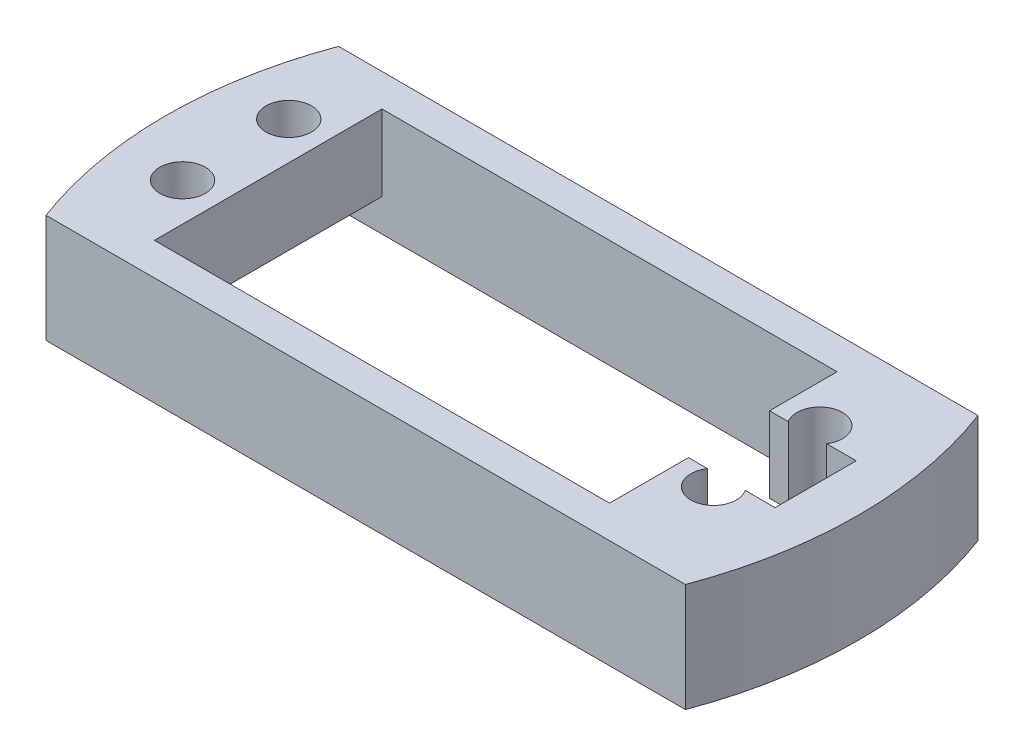
ISO-10303-21;
HEADER;
FILE_DESCRIPTION(('STEP AP214'),'2;1');
FILE_NAME('part.step','',(''),(''),'','','');
FILE_SCHEMA(('AUTOMOTIVE_DESIGN { 1 0 10303 214 1 1 1 1 }'));
ENDSEC;
DATA;
#1=APPLICATION_CONTEXT('core data for automotive mechanical design processes');
#2=APPLICATION_PROTOCOL_DEFINITION('international standard','automotive_design',2000,#1);
#3=PRODUCT_CONTEXT('',#1,'mechanical');
#4=PRODUCT('Part','Part','',(#3));
#5=PRODUCT_RELATED_PRODUCT_CATEGORY('part','',(#4));
#6=PRODUCT_DEFINITION_FORMATION('','',#4);
#7=PRODUCT_DEFINITION_CONTEXT('part definition',#1,'design');
#8=PRODUCT_DEFINITION('design','',#6,#7);
#9=PRODUCT_DEFINITION_SHAPE('','',#8);
#10=(LENGTH_UNIT() NAMED_UNIT(*) SI_UNIT(.MILLI.,.METRE.));
#11=(NAMED_UNIT(*) PLANE_ANGLE_UNIT() SI_UNIT($,.RADIAN.));
#12=(NAMED_UNIT(*) SI_UNIT($,.STERADIAN.) SOLID_ANGLE_UNIT());
#13=UNCERTAINTY_MEASURE_WITH_UNIT(LENGTH_MEASURE(1.E-05),#10,'distance_accuracy_value','');
#14=(GEOMETRIC_REPRESENTATION_CONTEXT(3) GLOBAL_UNCERTAINTY_ASSIGNED_CONTEXT((#13)) GLOBAL_UNIT_ASSIGNED_CONTEXT((#10,
#11,#12)) REPRESENTATION_CONTEXT('',''));
#15=CARTESIAN_POINT('',(0.,0.,0.));
#16=DIRECTION('',(0.,0.,1.));
#17=DIRECTION('',(1.,0.,0.));
#18=AXIS2_PLACEMENT_3D('',#15,#16,#17);
#19=CARTESIAN_POINT('',(-0.944487245360059,0.,-0.658978139905326));
#20=DIRECTION('',(0.,1.,0.));
#21=DIRECTION('',(0.,0.,1.));
#22=AXIS2_PLACEMENT_3D('',#19,#20,#21);
#23=PLANE('',#22);
#24=CARTESIAN_POINT('',(-0.944487245360059,0.,-0.658978139905326));
#25=DIRECTION('',(0.,1.,0.));
#26=DIRECTION('',(0.,0.,1.));
#27=AXIS2_PLACEMENT_3D('',#24,#25,#26);
#28=CIRCLE('',#27,38.5);
#29=CARTESIAN_POINT('',(-37.,0.,-14.1589781399053));
#30=VERTEX_POINT('',#29);
#31=CARTESIAN_POINT('',(-37.,0.,12.8410218600947));
#32=VERTEX_POINT('',#31);
#33=EDGE_CURVE('E216',#30,#32,#28,.T.);
#34=ORIENTED_EDGE('',*,*,#33,.F.);
#35=DIRECTION('',(-1.,0.,0.));
#36=VECTOR('',#35,1.);
#37=CARTESIAN_POINT('',(-37.,0.,-14.1589781399053));
#38=LINE('',#37,#36);
#39=CARTESIAN_POINT('',(22.,0.,-14.1589781399053));
#40=VERTEX_POINT('',#39);
#41=EDGE_CURVE('E226',#40,#30,#38,.T.);
#42=ORIENTED_EDGE('',*,*,#41,.F.);
#43=CARTESIAN_POINT('',(-14.0555127546399,0.,-0.658978139905322));
#44=DIRECTION('',(0.,1.,0.));
#45=DIRECTION('',(0.,0.,-1.));
#46=AXIS2_PLACEMENT_3D('',#43,#44,#45);
#47=CIRCLE('',#46,38.5);
#48=CARTESIAN_POINT('',(22.,0.,12.8410218600947));
#49=VERTEX_POINT('',#48);
#50=EDGE_CURVE('E237',#49,#40,#47,.T.);
#51=ORIENTED_EDGE('',*,*,#50,.F.);
#52=DIRECTION('',(1.,0.,0.));
#53=VECTOR('',#52,1.);
#54=CARTESIAN_POINT('',(-37.,0.,12.8410218600947));
#55=LINE('',#54,#53);
#56=EDGE_CURVE('E235',#32,#49,#55,.T.);
#57=ORIENTED_EDGE('',*,*,#56,.F.);
#58=EDGE_LOOP('',(#34,#42,#51,#57));
#59=FACE_BOUND('',#58,.T.);
#60=DIRECTION('',(-1.,0.,0.));
#61=VECTOR('',#60,1.);
#62=CARTESIAN_POINT('',(-30.,0.,-11.1589781399053));
#63=LINE('',#62,#61);
#64=CARTESIAN_POINT('',(19.9257558292541,0.,-11.1589781399053));
#65=VERTEX_POINT('',#64);
#66=CARTESIAN_POINT('',(-37.5773978895541,0.,-11.1589781399053));
#67=VERTEX_POINT('',#66);
#68=EDGE_CURVE('E323',#65,#67,#63,.T.);
#69=ORIENTED_EDGE('',*,*,#68,.T.);
#70=DIRECTION('',(0.,0.,1.));
#71=VECTOR('',#70,1.);
#72=CARTESIAN_POINT('',(-37.5773978895541,0.,-11.1589781399053));
#73=LINE('',#72,#71);
#74=CARTESIAN_POINT('',(-37.5773978895541,0.,9.84102186009467));
#75=VERTEX_POINT('',#74);
#76=EDGE_CURVE('E207',#67,#75,#73,.T.);
#77=ORIENTED_EDGE('',*,*,#76,.T.);
#78=DIRECTION('',(1.,0.,0.));
#79=VECTOR('',#78,1.);
#80=CARTESIAN_POINT('',(-30.,0.,9.84102186009467));
#81=LINE('',#80,#79);
#82=CARTESIAN_POINT('',(12.,0.,9.84102186009467));
#83=VERTEX_POINT('',#82);
#84=EDGE_CURVE('E325',#75,#83,#81,.T.);
#85=ORIENTED_EDGE('',*,*,#84,.T.);
#86=DIRECTION('',(0.,0.,-1.));
#87=VECTOR('',#86,1.);
#88=CARTESIAN_POINT('',(12.,0.,-11.1589781399053));
#89=LINE('',#88,#87);
#90=CARTESIAN_POINT('',(12.,0.,9.81782940820115));
#91=VERTEX_POINT('',#90);
#92=EDGE_CURVE('E311',#83,#91,#89,.T.);
#93=ORIENTED_EDGE('',*,*,#92,.T.);
#94=DIRECTION('',(1.,0.,0.));
#95=VECTOR('',#94,1.);
#96=CARTESIAN_POINT('',(12.,0.,9.81782940820115));
#97=LINE('',#96,#95);
#98=CARTESIAN_POINT('',(19.9257558292541,0.,9.81782940820115));
#99=VERTEX_POINT('',#98);
#100=EDGE_CURVE('E363',#91,#99,#97,.T.);
#101=ORIENTED_EDGE('',*,*,#100,.T.);
#102=DIRECTION('',(0.,0.,-1.));
#103=VECTOR('',#102,1.);
#104=CARTESIAN_POINT('',(19.9257558292541,0.,-11.1589781399053));
#105=LINE('',#104,#103);
#106=CARTESIAN_POINT('',(19.9257558292541,0.,2.56194208466654));
#107=VERTEX_POINT('',#106);
#108=EDGE_CURVE('E366',#99,#107,#105,.T.);
#109=ORIENTED_EDGE('',*,*,#108,.T.);
#110=DIRECTION('',(1.,0.,0.));
#111=VECTOR('',#110,1.);
#112=CARTESIAN_POINT('',(12.,0.,2.56194208466654));
#113=LINE('',#112,#111);
#114=CARTESIAN_POINT('',(20.,0.,2.56194208466654));
#115=VERTEX_POINT('',#114);
#116=EDGE_CURVE('E386',#107,#115,#113,.T.);
#117=ORIENTED_EDGE('',*,*,#116,.T.);
#118=DIRECTION('',(0.,0.,-1.));
#119=VECTOR('',#118,1.);
#120=CARTESIAN_POINT('',(20.,0.,-4.92377280863803));
#121=LINE('',#120,#119);
#122=CARTESIAN_POINT('',(20.,0.,-4.92377280863803));
#123=VERTEX_POINT('',#122);
#124=EDGE_CURVE('E393',#115,#123,#121,.T.);
#125=ORIENTED_EDGE('',*,*,#124,.T.);
#126=DIRECTION('',(-1.,0.,0.));
#127=VECTOR('',#126,1.);
#128=CARTESIAN_POINT('',(12.,0.,-4.92377280863803));
#129=LINE('',#128,#127);
#130=CARTESIAN_POINT('',(19.9257558292541,0.,-4.92377280863803));
#131=VERTEX_POINT('',#130);
#132=EDGE_CURVE('E291',#123,#131,#129,.T.);
#133=ORIENTED_EDGE('',*,*,#132,.T.);
#134=EDGE_CURVE('E365',#131,#65,#105,.T.);
#135=ORIENTED_EDGE('',*,*,#134,.T.);
#136=EDGE_LOOP('',(#69,#77,#85,#93,#101,#109,#117,#125,#133,#135));
#137=FACE_BOUND('',#136,.T.);
#138=ADVANCED_FACE('F36',(#59,#137),#23,.F.);
#139=CARTESIAN_POINT('',(12.,10.,-11.1589781399053));
#140=DIRECTION('',(-1.,0.,0.));
#141=DIRECTION('',(0.,0.,1.));
#142=AXIS2_PLACEMENT_3D('',#139,#140,#141);
#143=PLANE('',#142);
#144=DIRECTION('',(0.,0.,1.));
#145=VECTOR('',#144,1.);
#146=CARTESIAN_POINT('',(12.,3.,-11.1589781399053));
#147=LINE('',#146,#145);
#148=CARTESIAN_POINT('',(12.,3.,2.56194208466654));
#149=VERTEX_POINT('',#148);
#150=CARTESIAN_POINT('',(12.,3.,9.81782940820115));
#151=VERTEX_POINT('',#150);
#152=EDGE_CURVE('E278',#149,#151,#147,.T.);
#153=ORIENTED_EDGE('',*,*,#152,.T.);
#154=DIRECTION('',(0.,-1.,0.));
#155=VECTOR('',#154,1.);
#156=CARTESIAN_POINT('',(12.,3.,9.81782940820115));
#157=LINE('',#156,#155);
#158=EDGE_CURVE('E342',#151,#91,#157,.T.);
#159=ORIENTED_EDGE('',*,*,#158,.T.);
#160=ORIENTED_EDGE('',*,*,#92,.F.);
#161=DIRECTION('',(0.,-1.,0.));
#162=VECTOR('',#161,1.);
#163=CARTESIAN_POINT('',(12.,10.,9.84102186009467));
#164=LINE('',#163,#162);
#165=CARTESIAN_POINT('',(12.,10.,9.84102186009467));
#166=VERTEX_POINT('',#165);
#167=EDGE_CURVE('E218',#166,#83,#164,.T.);
#168=ORIENTED_EDGE('',*,*,#167,.F.);
#169=DIRECTION('',(0.,0.,-1.));
#170=VECTOR('',#169,1.);
#171=CARTESIAN_POINT('',(12.,10.,-11.1589781399053));
#172=LINE('',#171,#170);
#173=CARTESIAN_POINT('',(12.,10.,2.56194208466654));
#174=VERTEX_POINT('',#173);
#175=EDGE_CURVE('E312',#166,#174,#172,.T.);
#176=ORIENTED_EDGE('',*,*,#175,.T.);
#177=DIRECTION('',(0.,-1.,0.));
#178=VECTOR('',#177,1.);
#179=CARTESIAN_POINT('',(12.,10.,2.56194208466654));
#180=LINE('',#179,#178);
#181=EDGE_CURVE('E296',#174,#149,#180,.T.);
#182=ORIENTED_EDGE('',*,*,#181,.T.);
#183=EDGE_LOOP('',(#153,#159,#160,#168,#176,#182));
#184=FACE_BOUND('',#183,.T.);
#185=ADVANCED_FACE('F423',(#184),#143,.T.);
#186=CARTESIAN_POINT('',(12.,10.,2.56194208466654));
#187=DIRECTION('',(0.,0.,-1.));
#188=DIRECTION('',(-1.,0.,0.));
#189=AXIS2_PLACEMENT_3D('',#186,#187,#188);
#190=PLANE('',#189);
#191=ORIENTED_EDGE('',*,*,#116,.F.);
#192=DIRECTION('',(0.,1.,0.));
#193=VECTOR('',#192,1.);
#194=CARTESIAN_POINT('',(19.9257558292541,10.,2.56194208466654));
#195=LINE('',#194,#193);
#196=CARTESIAN_POINT('',(19.9257558292541,3.,2.56194208466654));
#197=VERTEX_POINT('',#196);
#198=EDGE_CURVE('E380',#107,#197,#195,.T.);
#199=ORIENTED_EDGE('',*,*,#198,.T.);
#200=DIRECTION('',(1.,0.,0.));
#201=VECTOR('',#200,1.);
#202=CARTESIAN_POINT('',(12.,3.,2.56194208466654));
#203=LINE('',#202,#201);
#204=CARTESIAN_POINT('',(17.2377487974895,3.,2.56194208466654));
#205=VERTEX_POINT('',#204);
#206=EDGE_CURVE('E375',#205,#197,#203,.T.);
#207=ORIENTED_EDGE('',*,*,#206,.F.);
#208=DIRECTION('',(0.,-1.,0.));
#209=VECTOR('',#208,1.);
#210=CARTESIAN_POINT('',(17.2377487974895,10.,2.56194208466654));
#211=LINE('',#210,#209);
#212=CARTESIAN_POINT('',(17.2377487974895,10.,2.56194208466654));
#213=VERTEX_POINT('',#212);
#214=EDGE_CURVE('E253',#213,#205,#211,.T.);
#215=ORIENTED_EDGE('',*,*,#214,.F.);
#216=DIRECTION('',(1.,0.,0.));
#217=VECTOR('',#216,1.);
#218=CARTESIAN_POINT('',(12.,10.,2.56194208466654));
#219=LINE('',#218,#217);
#220=CARTESIAN_POINT('',(20.,10.,2.56194208466654));
#221=VERTEX_POINT('',#220);
#222=EDGE_CURVE('E391',#213,#221,#219,.T.);
#223=ORIENTED_EDGE('',*,*,#222,.T.);
#224=DIRECTION('',(0.,-1.,0.));
#225=VECTOR('',#224,1.);
#226=CARTESIAN_POINT('',(20.,10.,2.56194208466654));
#227=LINE('',#226,#225);
#228=EDGE_CURVE('E286',#221,#115,#227,.T.);
#229=ORIENTED_EDGE('',*,*,#228,.T.);
#230=EDGE_LOOP('',(#191,#199,#207,#215,#223,#229));
#231=FACE_BOUND('',#230,.T.);
#232=ADVANCED_FACE('F402',(#231),#190,.T.);
#233=CARTESIAN_POINT('',(12.,10.,-4.92377280863803));
#234=DIRECTION('',(0.,0.,1.));
#235=DIRECTION('',(1.,0.,0.));
#236=AXIS2_PLACEMENT_3D('',#233,#234,#235);
#237=PLANE('',#236);
#238=DIRECTION('',(-1.,0.,0.));
#239=VECTOR('',#238,1.);
#240=CARTESIAN_POINT('',(12.,3.,-4.92377280863803));
#241=LINE('',#240,#239);
#242=CARTESIAN_POINT('',(19.9257558292541,3.,-4.92377280863803));
#243=VERTEX_POINT('',#242);
#244=CARTESIAN_POINT('',(17.2667226312759,3.,-4.92377280863803));
#245=VERTEX_POINT('',#244);
#246=EDGE_CURVE('E373',#243,#245,#241,.T.);
#247=ORIENTED_EDGE('',*,*,#246,.F.);
#248=DIRECTION('',(0.,-1.,0.));
#249=VECTOR('',#248,1.);
#250=CARTESIAN_POINT('',(19.9257558292541,10.,-4.92377280863803));
#251=LINE('',#250,#249);
#252=EDGE_CURVE('E11',#243,#131,#251,.T.);
#253=ORIENTED_EDGE('',*,*,#252,.T.);
#254=ORIENTED_EDGE('',*,*,#132,.F.);
#255=DIRECTION('',(0.,-1.,0.));
#256=VECTOR('',#255,1.);
#257=CARTESIAN_POINT('',(20.,10.,-4.92377280863803));
#258=LINE('',#257,#256);
#259=CARTESIAN_POINT('',(20.,10.,-4.92377280863803));
#260=VERTEX_POINT('',#259);
#261=EDGE_CURVE('E283',#260,#123,#258,.T.);
#262=ORIENTED_EDGE('',*,*,#261,.F.);
#263=DIRECTION('',(-1.,0.,0.));
#264=VECTOR('',#263,1.);
#265=CARTESIAN_POINT('',(12.,10.,-4.92377280863803));
#266=LINE('',#265,#264);
#267=CARTESIAN_POINT('',(17.2667226312759,10.,-4.92377280863803));
#268=VERTEX_POINT('',#267);
#269=EDGE_CURVE('E284',#260,#268,#266,.T.);
#270=ORIENTED_EDGE('',*,*,#269,.T.);
#271=DIRECTION('',(0.,-1.,0.));
#272=VECTOR('',#271,1.);
#273=CARTESIAN_POINT('',(17.2667226312759,10.,-4.92377280863803));
#274=LINE('',#273,#272);
#275=EDGE_CURVE('E256',#245,#268,#274,.F.);
#276=ORIENTED_EDGE('',*,*,#275,.F.);
#277=EDGE_LOOP('',(#247,#253,#254,#262,#270,#276));
#278=FACE_BOUND('',#277,.T.);
#279=ADVANCED_FACE('F415',(#278),#237,.T.);
#280=CARTESIAN_POINT('',(-0.944487245360059,10.,-0.658978139905326));
#281=DIRECTION('',(0.,1.,0.));
#282=DIRECTION('',(0.,0.,1.));
#283=AXIS2_PLACEMENT_3D('',#280,#281,#282);
#284=PLANE('',#283);
#285=CARTESIAN_POINT('',(-33.5,10.,-6.05897813990532));
#286=DIRECTION('',(0.,1.,0.));
#287=DIRECTION('',(0.,0.,-1.));
#288=AXIS2_PLACEMENT_3D('',#285,#286,#287);
#289=CIRCLE('',#288,2.1);
#290=CARTESIAN_POINT('',(-33.5,10.,-8.15897813990532));
#291=VERTEX_POINT('',#290);
#292=EDGE_CURVE('E302',#291,#291,#289,.T.);
#293=ORIENTED_EDGE('',*,*,#292,.F.);
#294=EDGE_LOOP('',(#293));
#295=FACE_BOUND('',#294,.T.);
#296=CARTESIAN_POINT('',(-0.944487245360059,10.,-0.658978139905326));
#297=DIRECTION('',(0.,1.,0.));
#298=DIRECTION('',(0.,0.,1.));
#299=AXIS2_PLACEMENT_3D('',#296,#297,#298);
#300=CIRCLE('',#299,38.5);
#301=CARTESIAN_POINT('',(-37.,10.,-14.1589781399053));
#302=VERTEX_POINT('',#301);
#303=CARTESIAN_POINT('',(-37.,10.,12.8410218600947));
#304=VERTEX_POINT('',#303);
#305=EDGE_CURVE('E222',#302,#304,#300,.T.);
#306=ORIENTED_EDGE('',*,*,#305,.T.);
#307=DIRECTION('',(1.,0.,0.));
#308=VECTOR('',#307,1.);
#309=CARTESIAN_POINT('',(-37.,10.,12.8410218600947));
#310=LINE('',#309,#308);
#311=CARTESIAN_POINT('',(22.,10.,12.8410218600947));
#312=VERTEX_POINT('',#311);
#313=EDGE_CURVE('E225',#304,#312,#310,.T.);
#314=ORIENTED_EDGE('',*,*,#313,.T.);
#315=CARTESIAN_POINT('',(-14.0555127546399,10.,-0.658978139905322));
#316=DIRECTION('',(0.,1.,0.));
#317=DIRECTION('',(0.,0.,-1.));
#318=AXIS2_PLACEMENT_3D('',#315,#316,#317);
#319=CIRCLE('',#318,38.5);
#320=CARTESIAN_POINT('',(22.,10.,-14.1589781399053));
#321=VERTEX_POINT('',#320);
#322=EDGE_CURVE('E228',#312,#321,#319,.T.);
#323=ORIENTED_EDGE('',*,*,#322,.T.);
#324=DIRECTION('',(-1.,0.,0.));
#325=VECTOR('',#324,1.);
#326=CARTESIAN_POINT('',(-37.,10.,-14.1589781399053));
#327=LINE('',#326,#325);
#328=EDGE_CURVE('E230',#321,#302,#327,.T.);
#329=ORIENTED_EDGE('',*,*,#328,.T.);
#330=EDGE_LOOP('',(#306,#314,#323,#329));
#331=FACE_BOUND('',#330,.T.);
#332=CARTESIAN_POINT('',(-33.5,10.,3.74102186009468));
#333=DIRECTION('',(0.,1.,0.));
#334=DIRECTION('',(0.,0.,-1.));
#335=AXIS2_PLACEMENT_3D('',#332,#333,#334);
#336=CIRCLE('',#335,2.1);
#337=CARTESIAN_POINT('',(-33.5,10.,1.64102186009468));
#338=VERTEX_POINT('',#337);
#339=EDGE_CURVE('E299',#338,#338,#336,.T.);
#340=ORIENTED_EDGE('',*,*,#339,.F.);
#341=EDGE_LOOP('',(#340));
#342=FACE_BOUND('',#341,.T.);
#343=CARTESIAN_POINT('',(15.5,10.,3.74102186009467));
#344=DIRECTION('',(0.,1.,0.));
#345=DIRECTION('',(0.,0.,1.));
#346=AXIS2_PLACEMENT_3D('',#343,#344,#345);
#347=CIRCLE('',#346,2.1);
#348=CARTESIAN_POINT('',(13.7622512025105,10.,2.56194208466654));
#349=VERTEX_POINT('',#348);
#350=EDGE_CURVE('E305',#349,#213,#347,.T.);
#351=ORIENTED_EDGE('',*,*,#350,.F.);
#352=EDGE_CURVE('E387',#174,#349,#219,.T.);
#353=ORIENTED_EDGE('',*,*,#352,.F.);
#354=ORIENTED_EDGE('',*,*,#175,.F.);
#355=DIRECTION('',(1.,0.,0.));
#356=VECTOR('',#355,1.);
#357=CARTESIAN_POINT('',(-30.,10.,9.84102186009467));
#358=LINE('',#357,#356);
#359=CARTESIAN_POINT('',(-30.,10.,9.84102186009467));
#360=VERTEX_POINT('',#359);
#361=EDGE_CURVE('E319',#360,#166,#358,.T.);
#362=ORIENTED_EDGE('',*,*,#361,.F.);
#363=DIRECTION('',(0.,0.,1.));
#364=VECTOR('',#363,1.);
#365=CARTESIAN_POINT('',(-30.,10.,-11.1589781399053));
#366=LINE('',#365,#364);
#367=CARTESIAN_POINT('',(-30.,10.,-11.1589781399053));
#368=VERTEX_POINT('',#367);
#369=EDGE_CURVE('E317',#368,#360,#366,.T.);
#370=ORIENTED_EDGE('',*,*,#369,.F.);
#371=DIRECTION('',(-1.,0.,0.));
#372=VECTOR('',#371,1.);
#373=CARTESIAN_POINT('',(-30.,10.,-11.1589781399053));
#374=LINE('',#373,#372);
#375=CARTESIAN_POINT('',(12.,10.,-11.1589781399053));
#376=VERTEX_POINT('',#375);
#377=EDGE_CURVE('E212',#376,#368,#374,.T.);
#378=ORIENTED_EDGE('',*,*,#377,.F.);
#379=CARTESIAN_POINT('',(12.,10.,-4.92377280863803));
#380=VERTEX_POINT('',#379);
#381=EDGE_CURVE('E315',#380,#376,#172,.T.);
#382=ORIENTED_EDGE('',*,*,#381,.F.);
#383=CARTESIAN_POINT('',(13.7332773687241,10.,-4.92377280863803));
#384=VERTEX_POINT('',#383);
#385=EDGE_CURVE('E282',#384,#380,#266,.T.);
#386=ORIENTED_EDGE('',*,*,#385,.F.);
#387=CARTESIAN_POINT('',(15.5,10.,-6.05897813990533));
#388=DIRECTION('',(0.,1.,0.));
#389=DIRECTION('',(0.,0.,1.));
#390=AXIS2_PLACEMENT_3D('',#387,#388,#389);
#391=CIRCLE('',#390,2.1);
#392=EDGE_CURVE('E308',#268,#384,#391,.T.);
#393=ORIENTED_EDGE('',*,*,#392,.F.);
#394=ORIENTED_EDGE('',*,*,#269,.F.);
#395=DIRECTION('',(0.,0.,-1.));
#396=VECTOR('',#395,1.);
#397=CARTESIAN_POINT('',(20.,10.,-4.92377280863803));
#398=LINE('',#397,#396);
#399=EDGE_CURVE('E390',#221,#260,#398,.T.);
#400=ORIENTED_EDGE('',*,*,#399,.F.);
#401=ORIENTED_EDGE('',*,*,#222,.F.);
#402=EDGE_LOOP('',(#351,#353,#354,#362,#370,#378,#382,#386,#393,#394,#400,#401));
#403=FACE_BOUND('',#402,.T.);
#404=ADVANCED_FACE('F410',(#295,#331,#342,#403),#284,.T.);
#405=CARTESIAN_POINT('',(12.,3.,-11.1589781399053));
#406=VERTEX_POINT('',#405);
#407=CARTESIAN_POINT('',(12.,3.,-4.92377280863803));
#408=VERTEX_POINT('',#407);
#409=EDGE_CURVE('E267',#406,#408,#147,.T.);
#410=ORIENTED_EDGE('',*,*,#409,.T.);
#411=DIRECTION('',(0.,-1.,0.));
#412=VECTOR('',#411,1.);
#413=CARTESIAN_POINT('',(12.,10.,-4.92377280863803));
#414=LINE('',#413,#412);
#415=EDGE_CURVE('E275',#380,#408,#414,.T.);
#416=ORIENTED_EDGE('',*,*,#415,.F.);
#417=ORIENTED_EDGE('',*,*,#381,.T.);
#418=DIRECTION('',(0.,-1.,0.));
#419=VECTOR('',#418,1.);
#420=CARTESIAN_POINT('',(12.,10.,-11.1589781399053));
#421=LINE('',#420,#419);
#422=EDGE_CURVE('E213',#376,#406,#421,.T.);
#423=ORIENTED_EDGE('',*,*,#422,.T.);
#424=EDGE_LOOP('',(#410,#416,#417,#423));
#425=FACE_BOUND('',#424,.T.);
#426=ADVANCED_FACE('F274',(#425),#143,.T.);
#427=CARTESIAN_POINT('',(15.5,10.,-6.05897813990533));
#428=DIRECTION('',(0.,-1.,0.));
#429=DIRECTION('',(0.,0.,-1.));
#430=AXIS2_PLACEMENT_3D('',#427,#428,#429);
#431=CYLINDRICAL_SURFACE('',#430,2.1);
#432=CARTESIAN_POINT('',(15.5,3.,-6.05897813990533));
#433=DIRECTION('',(0.,1.,0.));
#434=DIRECTION('',(0.,0.,1.));
#435=AXIS2_PLACEMENT_3D('',#432,#433,#434);
#436=CIRCLE('',#435,2.1);
#437=CARTESIAN_POINT('',(13.7332773687241,3.,-4.92377280863803));
#438=VERTEX_POINT('',#437);
#439=EDGE_CURVE('E269',#245,#438,#436,.T.);
#440=ORIENTED_EDGE('',*,*,#439,.F.);
#441=ORIENTED_EDGE('',*,*,#275,.T.);
#442=ORIENTED_EDGE('',*,*,#392,.T.);
#443=DIRECTION('',(0.,-1.,0.));
#444=VECTOR('',#443,1.);
#445=CARTESIAN_POINT('',(13.7332773687241,10.,-4.92377280863803));
#446=LINE('',#445,#444);
#447=EDGE_CURVE('E258',#384,#438,#446,.T.);
#448=ORIENTED_EDGE('',*,*,#447,.T.);
#449=EDGE_LOOP('',(#440,#441,#442,#448));
#450=FACE_BOUND('',#449,.T.);
#451=ADVANCED_FACE('F432',(#450),#431,.F.);
#452=CARTESIAN_POINT('',(15.5,10.,3.74102186009467));
#453=DIRECTION('',(0.,-1.,0.));
#454=DIRECTION('',(0.,0.,-1.));
#455=AXIS2_PLACEMENT_3D('',#452,#453,#454);
#456=CYLINDRICAL_SURFACE('',#455,2.1);
#457=CARTESIAN_POINT('',(15.5,3.,3.74102186009467));
#458=DIRECTION('',(0.,1.,0.));
#459=DIRECTION('',(0.,0.,1.));
#460=AXIS2_PLACEMENT_3D('',#457,#458,#459);
#461=CIRCLE('',#460,2.1);
#462=CARTESIAN_POINT('',(13.7622512025105,3.,2.56194208466654));
#463=VERTEX_POINT('',#462);
#464=EDGE_CURVE('E60',#463,#205,#461,.T.);
#465=ORIENTED_EDGE('',*,*,#464,.F.);
#466=DIRECTION('',(0.,-1.,0.));
#467=VECTOR('',#466,1.);
#468=CARTESIAN_POINT('',(13.7622512025105,10.,2.56194208466654));
#469=LINE('',#468,#467);
#470=EDGE_CURVE('E251',#463,#349,#469,.F.);
#471=ORIENTED_EDGE('',*,*,#470,.T.);
#472=ORIENTED_EDGE('',*,*,#350,.T.);
#473=ORIENTED_EDGE('',*,*,#214,.T.);
#474=EDGE_LOOP('',(#465,#471,#472,#473));
#475=FACE_BOUND('',#474,.T.);
#476=ADVANCED_FACE('F430',(#475),#456,.F.);
#477=CARTESIAN_POINT('',(-0.944487245360059,10.,-0.658978139905326));
#478=DIRECTION('',(0.,-1.,0.));
#479=DIRECTION('',(0.,0.,-1.));
#480=AXIS2_PLACEMENT_3D('',#477,#478,#479);
#481=CYLINDRICAL_SURFACE('',#480,38.5);
#482=ORIENTED_EDGE('',*,*,#33,.T.);
#483=DIRECTION('',(0.,-1.,0.));
#484=VECTOR('',#483,1.);
#485=CARTESIAN_POINT('',(-37.,10.,12.8410218600947));
#486=LINE('',#485,#484);
#487=EDGE_CURVE('E248',#304,#32,#486,.T.);
#488=ORIENTED_EDGE('',*,*,#487,.F.);
#489=ORIENTED_EDGE('',*,*,#305,.F.);
#490=DIRECTION('',(0.,-1.,0.));
#491=VECTOR('',#490,1.);
#492=CARTESIAN_POINT('',(-37.,10.,-14.1589781399053));
#493=LINE('',#492,#491);
#494=EDGE_CURVE('E232',#302,#30,#493,.T.);
#495=ORIENTED_EDGE('',*,*,#494,.T.);
#496=EDGE_LOOP('',(#482,#488,#489,#495));
#497=FACE_BOUND('',#496,.T.);
#498=ADVANCED_FACE('F38',(#497),#481,.T.);
#499=CARTESIAN_POINT('',(-37.,10.,12.8410218600947));
#500=DIRECTION('',(0.,0.,-1.));
#501=DIRECTION('',(-1.,0.,0.));
#502=AXIS2_PLACEMENT_3D('',#499,#500,#501);
#503=PLANE('',#502);
#504=ORIENTED_EDGE('',*,*,#56,.T.);
#505=DIRECTION('',(0.,-1.,0.));
#506=VECTOR('',#505,1.);
#507=CARTESIAN_POINT('',(22.,10.,12.8410218600947));
#508=LINE('',#507,#506);
#509=EDGE_CURVE('E245',#312,#49,#508,.T.);
#510=ORIENTED_EDGE('',*,*,#509,.F.);
#511=ORIENTED_EDGE('',*,*,#313,.F.);
#512=ORIENTED_EDGE('',*,*,#487,.T.);
#513=EDGE_LOOP('',(#504,#510,#511,#512));
#514=FACE_BOUND('',#513,.T.);
#515=ADVANCED_FACE('F438',(#514),#503,.F.);
#516=CARTESIAN_POINT('',(-14.0555127546399,10.,-0.658978139905322));
#517=DIRECTION('',(0.,-1.,0.));
#518=DIRECTION('',(0.,0.,-1.));
#519=AXIS2_PLACEMENT_3D('',#516,#517,#518);
#520=CYLINDRICAL_SURFACE('',#519,38.5);
#521=ORIENTED_EDGE('',*,*,#50,.T.);
#522=DIRECTION('',(0.,-1.,0.));
#523=VECTOR('',#522,1.);
#524=CARTESIAN_POINT('',(22.,10.,-14.1589781399053));
#525=LINE('',#524,#523);
#526=EDGE_CURVE('E242',#321,#40,#525,.T.);
#527=ORIENTED_EDGE('',*,*,#526,.F.);
#528=ORIENTED_EDGE('',*,*,#322,.F.);
#529=ORIENTED_EDGE('',*,*,#509,.T.);
#530=EDGE_LOOP('',(#521,#527,#528,#529));
#531=FACE_BOUND('',#530,.T.);
#532=ADVANCED_FACE('F456',(#531),#520,.T.);
#533=CARTESIAN_POINT('',(-37.,10.,-14.1589781399053));
#534=DIRECTION('',(0.,0.,1.));
#535=DIRECTION('',(1.,0.,0.));
#536=AXIS2_PLACEMENT_3D('',#533,#534,#535);
#537=PLANE('',#536);
#538=ORIENTED_EDGE('',*,*,#41,.T.);
#539=ORIENTED_EDGE('',*,*,#494,.F.);
#540=ORIENTED_EDGE('',*,*,#328,.F.);
#541=ORIENTED_EDGE('',*,*,#526,.T.);
#542=EDGE_LOOP('',(#538,#539,#540,#541));
#543=FACE_BOUND('',#542,.T.);
#544=ADVANCED_FACE('F453',(#543),#537,.F.);
#545=CARTESIAN_POINT('',(-30.,10.,-11.1589781399053));
#546=DIRECTION('',(0.,0.,1.));
#547=DIRECTION('',(1.,0.,0.));
#548=AXIS2_PLACEMENT_3D('',#545,#546,#547);
#549=PLANE('',#548);
#550=ORIENTED_EDGE('',*,*,#68,.F.);
#551=DIRECTION('',(0.,-1.,0.));
#552=VECTOR('',#551,1.);
#553=CARTESIAN_POINT('',(19.9257558292541,3.,-11.1589781399053));
#554=LINE('',#553,#552);
#555=CARTESIAN_POINT('',(19.9257558292541,3.,-11.1589781399053));
#556=VERTEX_POINT('',#555);
#557=EDGE_CURVE('E362',#556,#65,#554,.T.);
#558=ORIENTED_EDGE('',*,*,#557,.F.);
#559=DIRECTION('',(-1.,0.,0.));
#560=VECTOR('',#559,1.);
#561=CARTESIAN_POINT('',(12.,3.,-11.1589781399053));
#562=LINE('',#561,#560);
#563=EDGE_CURVE('E360',#556,#406,#562,.T.);
#564=ORIENTED_EDGE('',*,*,#563,.T.);
#565=ORIENTED_EDGE('',*,*,#422,.F.);
#566=ORIENTED_EDGE('',*,*,#377,.T.);
#567=DIRECTION('',(0.,-1.,0.));
#568=VECTOR('',#567,1.);
#569=CARTESIAN_POINT('',(-30.,10.,-11.1589781399053));
#570=LINE('',#569,#568);
#571=CARTESIAN_POINT('',(-30.,3.,-11.1589781399053));
#572=VERTEX_POINT('',#571);
#573=EDGE_CURVE('E204',#368,#572,#570,.T.);
#574=ORIENTED_EDGE('',*,*,#573,.T.);
#575=DIRECTION('',(-1.,0.,0.));
#576=VECTOR('',#575,1.);
#577=CARTESIAN_POINT('',(-30.,3.,-11.1589781399053));
#578=LINE('',#577,#576);
#579=CARTESIAN_POINT('',(-37.5773978895541,3.,-11.1589781399053));
#580=VERTEX_POINT('',#579);
#581=EDGE_CURVE('E191',#572,#580,#578,.T.);
#582=ORIENTED_EDGE('',*,*,#581,.T.);
#583=DIRECTION('',(0.,-1.,0.));
#584=VECTOR('',#583,1.);
#585=CARTESIAN_POINT('',(-37.5773978895541,3.,-11.1589781399053));
#586=LINE('',#585,#584);
#587=EDGE_CURVE('E353',#580,#67,#586,.T.);
#588=ORIENTED_EDGE('',*,*,#587,.T.);
#589=EDGE_LOOP('',(#550,#558,#564,#565,#566,#574,#582,#588));
#590=FACE_BOUND('',#589,.T.);
#591=ADVANCED_FACE('F209',(#590),#549,.T.);
#592=CARTESIAN_POINT('',(-30.,10.,-11.1589781399053));
#593=DIRECTION('',(1.,0.,0.));
#594=DIRECTION('',(0.,0.,-1.));
#595=AXIS2_PLACEMENT_3D('',#592,#593,#594);
#596=PLANE('',#595);
#597=DIRECTION('',(0.,0.,-1.));
#598=VECTOR('',#597,1.);
#599=CARTESIAN_POINT('',(-30.,3.,-11.1589781399053));
#600=LINE('',#599,#598);
#601=CARTESIAN_POINT('',(-30.,3.,9.84102186009467));
#602=VERTEX_POINT('',#601);
#603=EDGE_CURVE('E52',#602,#572,#600,.T.);
#604=ORIENTED_EDGE('',*,*,#603,.T.);
#605=ORIENTED_EDGE('',*,*,#573,.F.);
#606=ORIENTED_EDGE('',*,*,#369,.T.);
#607=DIRECTION('',(0.,-1.,0.));
#608=VECTOR('',#607,1.);
#609=CARTESIAN_POINT('',(-30.,10.,9.84102186009467));
#610=LINE('',#609,#608);
#611=EDGE_CURVE('E206',#360,#602,#610,.T.);
#612=ORIENTED_EDGE('',*,*,#611,.T.);
#613=EDGE_LOOP('',(#604,#605,#606,#612));
#614=FACE_BOUND('',#613,.T.);
#615=ADVANCED_FACE('F202',(#614),#596,.T.);
#616=CARTESIAN_POINT('',(-30.,10.,9.84102186009467));
#617=DIRECTION('',(0.,0.,-1.));
#618=DIRECTION('',(-1.,0.,0.));
#619=AXIS2_PLACEMENT_3D('',#616,#617,#618);
#620=PLANE('',#619);
#621=ORIENTED_EDGE('',*,*,#84,.F.);
#622=DIRECTION('',(0.,-1.,0.));
#623=VECTOR('',#622,1.);
#624=CARTESIAN_POINT('',(-37.5773978895541,3.,9.84102186009467));
#625=LINE('',#624,#623);
#626=CARTESIAN_POINT('',(-37.5773978895541,3.,9.84102186009467));
#627=VERTEX_POINT('',#626);
#628=EDGE_CURVE('E351',#627,#75,#625,.T.);
#629=ORIENTED_EDGE('',*,*,#628,.F.);
#630=DIRECTION('',(1.,0.,0.));
#631=VECTOR('',#630,1.);
#632=CARTESIAN_POINT('',(-37.5773978895541,3.,9.84102186009467));
#633=LINE('',#632,#631);
#634=EDGE_CURVE('E349',#627,#602,#633,.T.);
#635=ORIENTED_EDGE('',*,*,#634,.T.);
#636=ORIENTED_EDGE('',*,*,#611,.F.);
#637=ORIENTED_EDGE('',*,*,#361,.T.);
#638=ORIENTED_EDGE('',*,*,#167,.T.);
#639=EDGE_LOOP('',(#621,#629,#635,#636,#637,#638));
#640=FACE_BOUND('',#639,.T.);
#641=ADVANCED_FACE('F330',(#640),#620,.T.);
#642=CARTESIAN_POINT('',(-33.5,10.,-6.05897813990532));
#643=DIRECTION('',(0.,-1.,0.));
#644=DIRECTION('',(0.,0.,-1.));
#645=AXIS2_PLACEMENT_3D('',#642,#643,#644);
#646=CYLINDRICAL_SURFACE('',#645,2.1);
#647=CARTESIAN_POINT('',(-33.5,3.,-6.05897813990532));
#648=DIRECTION('',(0.,1.,0.));
#649=DIRECTION('',(0.,0.,1.));
#650=AXIS2_PLACEMENT_3D('',#647,#648,#649);
#651=CIRCLE('',#650,2.1);
#652=CARTESIAN_POINT('',(-33.5,3.,-3.95897813990532));
#653=VERTEX_POINT('',#652);
#654=EDGE_CURVE('E383',#653,#653,#651,.T.);
#655=ORIENTED_EDGE('',*,*,#654,.F.);
#656=EDGE_LOOP('',(#655));
#657=FACE_BOUND('',#656,.T.);
#658=ORIENTED_EDGE('',*,*,#292,.T.);
#659=EDGE_LOOP('',(#658));
#660=FACE_BOUND('',#659,.T.);
#661=ADVANCED_FACE('F481',(#657,#660),#646,.F.);
#662=CARTESIAN_POINT('',(-33.5,10.,3.74102186009468));
#663=DIRECTION('',(0.,-1.,0.));
#664=DIRECTION('',(0.,0.,-1.));
#665=AXIS2_PLACEMENT_3D('',#662,#663,#664);
#666=CYLINDRICAL_SURFACE('',#665,2.1);
#667=CARTESIAN_POINT('',(-33.5,3.,3.74102186009468));
#668=DIRECTION('',(0.,1.,0.));
#669=DIRECTION('',(0.,0.,1.));
#670=AXIS2_PLACEMENT_3D('',#667,#668,#669);
#671=CIRCLE('',#670,2.1);
#672=CARTESIAN_POINT('',(-33.5,3.,5.84102186009468));
#673=VERTEX_POINT('',#672);
#674=EDGE_CURVE('E40',#673,#673,#671,.T.);
#675=ORIENTED_EDGE('',*,*,#674,.F.);
#676=EDGE_LOOP('',(#675));
#677=FACE_BOUND('',#676,.T.);
#678=ORIENTED_EDGE('',*,*,#339,.T.);
#679=EDGE_LOOP('',(#678));
#680=FACE_BOUND('',#679,.T.);
#681=ADVANCED_FACE('F479',(#677,#680),#666,.F.);
#682=DIRECTION('',(1.,0.,0.));
#683=VECTOR('',#682,1.);
#684=CARTESIAN_POINT('',(12.,3.,2.56194208466654));
#685=LINE('',#684,#683);
#686=EDGE_CURVE('E378',#149,#463,#685,.T.);
#687=ORIENTED_EDGE('',*,*,#686,.F.);
#688=ORIENTED_EDGE('',*,*,#181,.F.);
#689=ORIENTED_EDGE('',*,*,#352,.T.);
#690=ORIENTED_EDGE('',*,*,#470,.F.);
#691=EDGE_LOOP('',(#687,#688,#689,#690));
#692=FACE_BOUND('',#691,.T.);
#693=ADVANCED_FACE('F426',(#692),#190,.T.);
#694=CARTESIAN_POINT('',(20.,10.,-4.92377280863803));
#695=DIRECTION('',(-1.,0.,0.));
#696=DIRECTION('',(0.,0.,1.));
#697=AXIS2_PLACEMENT_3D('',#694,#695,#696);
#698=PLANE('',#697);
#699=ORIENTED_EDGE('',*,*,#124,.F.);
#700=ORIENTED_EDGE('',*,*,#228,.F.);
#701=ORIENTED_EDGE('',*,*,#399,.T.);
#702=ORIENTED_EDGE('',*,*,#261,.T.);
#703=EDGE_LOOP('',(#699,#700,#701,#702));
#704=FACE_BOUND('',#703,.T.);
#705=ADVANCED_FACE('F407',(#704),#698,.T.);
#706=DIRECTION('',(-1.,0.,0.));
#707=VECTOR('',#706,1.);
#708=CARTESIAN_POINT('',(12.,3.,-4.92377280863803));
#709=LINE('',#708,#707);
#710=EDGE_CURVE('E45',#438,#408,#709,.T.);
#711=ORIENTED_EDGE('',*,*,#710,.F.);
#712=ORIENTED_EDGE('',*,*,#447,.F.);
#713=ORIENTED_EDGE('',*,*,#385,.T.);
#714=ORIENTED_EDGE('',*,*,#415,.T.);
#715=EDGE_LOOP('',(#711,#712,#713,#714));
#716=FACE_BOUND('',#715,.T.);
#717=ADVANCED_FACE('F280',(#716),#237,.T.);
#718=CARTESIAN_POINT('',(0.,3.,0.));
#719=DIRECTION('',(0.,1.,0.));
#720=DIRECTION('',(0.,0.,1.));
#721=AXIS2_PLACEMENT_3D('',#718,#719,#720);
#722=PLANE('',#721);
#723=ORIENTED_EDGE('',*,*,#246,.T.);
#724=ORIENTED_EDGE('',*,*,#439,.T.);
#725=ORIENTED_EDGE('',*,*,#710,.T.);
#726=ORIENTED_EDGE('',*,*,#409,.F.);
#727=ORIENTED_EDGE('',*,*,#563,.F.);
#728=DIRECTION('',(0.,0.,-1.));
#729=VECTOR('',#728,1.);
#730=CARTESIAN_POINT('',(19.9257558292541,3.,-11.1589781399053));
#731=LINE('',#730,#729);
#732=EDGE_CURVE('E356',#243,#556,#731,.T.);
#733=ORIENTED_EDGE('',*,*,#732,.F.);
#734=EDGE_LOOP('',(#723,#724,#725,#726,#727,#733));
#735=FACE_BOUND('',#734,.T.);
#736=ADVANCED_FACE('F265',(#735),#722,.F.);
#737=CARTESIAN_POINT('',(19.9257558292541,3.,-11.1589781399053));
#738=DIRECTION('',(-1.,0.,0.));
#739=DIRECTION('',(0.,0.,1.));
#740=AXIS2_PLACEMENT_3D('',#737,#738,#739);
#741=PLANE('',#740);
#742=ORIENTED_EDGE('',*,*,#732,.T.);
#743=ORIENTED_EDGE('',*,*,#557,.T.);
#744=ORIENTED_EDGE('',*,*,#134,.F.);
#745=ORIENTED_EDGE('',*,*,#252,.F.);
#746=EDGE_LOOP('',(#742,#743,#744,#745));
#747=FACE_BOUND('',#746,.T.);
#748=ADVANCED_FACE('F418',(#747),#741,.T.);
#749=ORIENTED_EDGE('',*,*,#108,.F.);
#750=DIRECTION('',(0.,-1.,0.));
#751=VECTOR('',#750,1.);
#752=CARTESIAN_POINT('',(19.9257558292541,3.,9.81782940820115));
#753=LINE('',#752,#751);
#754=CARTESIAN_POINT('',(19.9257558292541,3.,9.81782940820115));
#755=VERTEX_POINT('',#754);
#756=EDGE_CURVE('E345',#755,#99,#753,.T.);
#757=ORIENTED_EDGE('',*,*,#756,.F.);
#758=EDGE_CURVE('E357',#755,#197,#731,.T.);
#759=ORIENTED_EDGE('',*,*,#758,.T.);
#760=ORIENTED_EDGE('',*,*,#198,.F.);
#761=EDGE_LOOP('',(#749,#757,#759,#760));
#762=FACE_BOUND('',#761,.T.);
#763=ADVANCED_FACE('F502',(#762),#741,.T.);
#764=ORIENTED_EDGE('',*,*,#686,.T.);
#765=ORIENTED_EDGE('',*,*,#464,.T.);
#766=ORIENTED_EDGE('',*,*,#206,.T.);
#767=ORIENTED_EDGE('',*,*,#758,.F.);
#768=DIRECTION('',(1.,0.,0.));
#769=VECTOR('',#768,1.);
#770=CARTESIAN_POINT('',(12.,3.,9.81782940820115));
#771=LINE('',#770,#769);
#772=EDGE_CURVE('E277',#151,#755,#771,.T.);
#773=ORIENTED_EDGE('',*,*,#772,.F.);
#774=ORIENTED_EDGE('',*,*,#152,.F.);
#775=EDGE_LOOP('',(#764,#765,#766,#767,#773,#774));
#776=FACE_BOUND('',#775,.T.);
#777=ADVANCED_FACE('F428',(#776),#722,.F.);
#778=CARTESIAN_POINT('',(12.,3.,9.81782940820115));
#779=DIRECTION('',(0.,0.,-1.));
#780=DIRECTION('',(-1.,0.,0.));
#781=AXIS2_PLACEMENT_3D('',#778,#779,#780);
#782=PLANE('',#781);
#783=ORIENTED_EDGE('',*,*,#100,.F.);
#784=ORIENTED_EDGE('',*,*,#158,.F.);
#785=ORIENTED_EDGE('',*,*,#772,.T.);
#786=ORIENTED_EDGE('',*,*,#756,.T.);
#787=EDGE_LOOP('',(#783,#784,#785,#786));
#788=FACE_BOUND('',#787,.T.);
#789=ADVANCED_FACE('F496',(#788),#782,.T.);
#790=CARTESIAN_POINT('',(-37.5773978895541,3.,-11.1589781399053));
#791=DIRECTION('',(1.,0.,0.));
#792=DIRECTION('',(0.,0.,-1.));
#793=AXIS2_PLACEMENT_3D('',#790,#791,#792);
#794=PLANE('',#793);
#795=ORIENTED_EDGE('',*,*,#76,.F.);
#796=ORIENTED_EDGE('',*,*,#587,.F.);
#797=DIRECTION('',(0.,0.,1.));
#798=VECTOR('',#797,1.);
#799=CARTESIAN_POINT('',(-37.5773978895541,3.,-11.1589781399053));
#800=LINE('',#799,#798);
#801=EDGE_CURVE('E193',#580,#627,#800,.T.);
#802=ORIENTED_EDGE('',*,*,#801,.T.);
#803=ORIENTED_EDGE('',*,*,#628,.T.);
#804=EDGE_LOOP('',(#795,#796,#802,#803));
#805=FACE_BOUND('',#804,.T.);
#806=ADVANCED_FACE('F420',(#805),#794,.T.);
#807=CARTESIAN_POINT('',(0.,3.,0.));
#808=DIRECTION('',(0.,1.,0.));
#809=DIRECTION('',(0.,0.,1.));
#810=AXIS2_PLACEMENT_3D('',#807,#808,#809);
#811=PLANE('',#810);
#812=ORIENTED_EDGE('',*,*,#654,.T.);
#813=EDGE_LOOP('',(#812));
#814=FACE_BOUND('',#813,.T.);
#815=ORIENTED_EDGE('',*,*,#674,.T.);
#816=EDGE_LOOP('',(#815));
#817=FACE_BOUND('',#816,.T.);
#818=ORIENTED_EDGE('',*,*,#603,.F.);
#819=ORIENTED_EDGE('',*,*,#634,.F.);
#820=ORIENTED_EDGE('',*,*,#801,.F.);
#821=ORIENTED_EDGE('',*,*,#581,.F.);
#822=EDGE_LOOP('',(#818,#819,#820,#821));
#823=FACE_BOUND('',#822,.T.);
#824=ADVANCED_FACE('F192',(#814,#817,#823),#811,.F.);
#825=CLOSED_SHELL('',(#138,#185,#232,#279,#404,#426,#451,#476,#498,#515,#532,#544,#591,#615,
#641,#661,#681,#693,#705,#717,#736,#748,#763,#777,#789,#806,#824));
#826=MANIFOLD_SOLID_BREP('B2',#825);
#827=ADVANCED_BREP_SHAPE_REPRESENTATION('',(#18,#826),#14);
#828=SHAPE_DEFINITION_REPRESENTATION(#9,#827);
ENDSEC;
END-ISO-10303-21;
